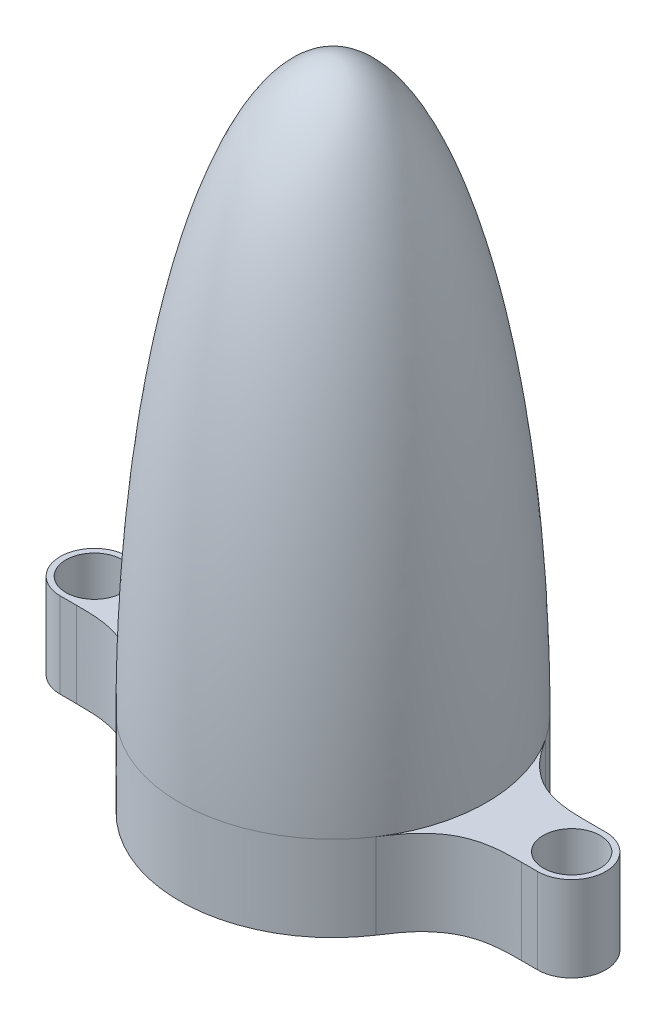
ISO-10303-21;
HEADER;
FILE_DESCRIPTION(('STEP AP214'),'2;1');
FILE_NAME('part.step','',(''),(''),'','','');
FILE_SCHEMA(('AUTOMOTIVE_DESIGN { 1 0 10303 214 1 1 1 1 }'));
ENDSEC;
DATA;
#1=APPLICATION_CONTEXT('core data for automotive mechanical design processes');
#2=APPLICATION_PROTOCOL_DEFINITION('international standard','automotive_design',2000,#1);
#3=PRODUCT_CONTEXT('',#1,'mechanical');
#4=PRODUCT('Part','Part','',(#3));
#5=PRODUCT_RELATED_PRODUCT_CATEGORY('part','',(#4));
#6=PRODUCT_DEFINITION_FORMATION('','',#4);
#7=PRODUCT_DEFINITION_CONTEXT('part definition',#1,'design');
#8=PRODUCT_DEFINITION('design','',#6,#7);
#9=PRODUCT_DEFINITION_SHAPE('','',#8);
#10=(LENGTH_UNIT() NAMED_UNIT(*) SI_UNIT(.MILLI.,.METRE.));
#11=(NAMED_UNIT(*) PLANE_ANGLE_UNIT() SI_UNIT($,.RADIAN.));
#12=(NAMED_UNIT(*) SI_UNIT($,.STERADIAN.) SOLID_ANGLE_UNIT());
#13=UNCERTAINTY_MEASURE_WITH_UNIT(LENGTH_MEASURE(1.E-05),#10,'distance_accuracy_value','');
#14=(GEOMETRIC_REPRESENTATION_CONTEXT(3) GLOBAL_UNCERTAINTY_ASSIGNED_CONTEXT((#13)) GLOBAL_UNIT_ASSIGNED_CONTEXT((#10,
#11,#12)) REPRESENTATION_CONTEXT('',''));
#15=CARTESIAN_POINT('',(0.,0.,0.));
#16=DIRECTION('',(0.,0.,1.));
#17=DIRECTION('',(1.,0.,0.));
#18=AXIS2_PLACEMENT_3D('',#15,#16,#17);
#19=CARTESIAN_POINT('',(0.,15.,0.));
#20=DIRECTION('',(0.,1.,0.));
#21=DIRECTION('',(0.,0.,1.));
#22=AXIS2_PLACEMENT_3D('',#19,#20,#21);
#23=PLANE('',#22);
#24=CARTESIAN_POINT('',(-42.,15.,0.));
#25=DIRECTION('',(0.,1.,0.));
#26=DIRECTION('',(0.,0.,1.));
#27=AXIS2_PLACEMENT_3D('',#24,#25,#26);
#28=CIRCLE('',#27,5.);
#29=CARTESIAN_POINT('',(-42.,15.,5.));
#30=VERTEX_POINT('',#29);
#31=EDGE_CURVE('E417',#30,#30,#28,.T.);
#32=ORIENTED_EDGE('',*,*,#31,.F.);
#33=EDGE_LOOP('',(#32));
#34=FACE_BOUND('',#33,.T.);
#35=CARTESIAN_POINT('',(-22.4924613898807,15.,14.9361702127662));
#36=CARTESIAN_POINT('',(-23.3032251088838,15.,13.71523664102));
#37=CARTESIAN_POINT('',(-24.1883136926682,15.,12.2026104979751));
#38=CARTESIAN_POINT('',(-27.3449063447516,15.,8.24468675659149));
#39=CARTESIAN_POINT('',(-31.1830848978388,15.,6.43790844660435));
#40=CARTESIAN_POINT('',(-35.2832759163573,15.,5.99999999999523));
#41=CARTESIAN_POINT('',(-37.2184099086305,15.,5.99999999999762));
#42=CARTESIAN_POINT('',(-39.1535439009038,15.,6.));
#43=B_SPLINE_CURVE_WITH_KNOTS('',5,(#35,#36,#37,#38,#39,#40,#41,#42),.UNSPECIFIED.,.F.,.F.,(6,2,
6),(0.,0.5,1.),.UNSPECIFIED.);
#44=CARTESIAN_POINT('',(-22.4924613898807,15.,14.9361702127662));
#45=VERTEX_POINT('',#44);
#46=CARTESIAN_POINT('',(-39.1535439009038,15.,6.));
#47=VERTEX_POINT('',#46);
#48=EDGE_CURVE('E62',#45,#47,#43,.T.);
#49=ORIENTED_EDGE('',*,*,#48,.F.);
#50=CARTESIAN_POINT('',(0.,15.,0.));
#51=DIRECTION('',(0.,-1.,0.));
#52=DIRECTION('',(0.,0.,-1.));
#53=AXIS2_PLACEMENT_3D('',#50,#51,#52);
#54=CIRCLE('',#53,27.);
#55=CARTESIAN_POINT('',(-22.4924613898804,15.,-14.9361702127668));
#56=VERTEX_POINT('',#55);
#57=EDGE_CURVE('E397',#45,#56,#54,.T.);
#58=ORIENTED_EDGE('',*,*,#57,.T.);
#59=CARTESIAN_POINT('',(-39.1535439009038,15.,-6.00000000000001));
#60=CARTESIAN_POINT('',(-37.2184099086401,15.,-5.99999999999285));
#61=CARTESIAN_POINT('',(-35.2832759163763,15.,-5.99999999998748));
#62=CARTESIAN_POINT('',(-31.1830848978484,15.,-6.4379084465972));
#63=CARTESIAN_POINT('',(-27.3449063447301,15.,-8.24468675658434));
#64=CARTESIAN_POINT('',(-24.1883136926539,15.,-12.2026104979882));
#65=CARTESIAN_POINT('',(-23.3032251088743,15.,-13.7152366410295));
#66=CARTESIAN_POINT('',(-22.4924613898804,15.,-14.9361702127668));
#67=B_SPLINE_CURVE_WITH_KNOTS('',5,(#59,#60,#61,#62,#63,#64,#65,#66),.UNSPECIFIED.,.F.,.F.,(6,2,
6),(0.,0.5,1.),.UNSPECIFIED.);
#68=CARTESIAN_POINT('',(-39.1535439009038,15.,-6.));
#69=VERTEX_POINT('',#68);
#70=EDGE_CURVE('E394',#69,#56,#67,.T.);
#71=ORIENTED_EDGE('',*,*,#70,.F.);
#72=DIRECTION('',(1.,0.,0.));
#73=VECTOR('',#72,1.);
#74=CARTESIAN_POINT('',(0.,15.,-6.));
#75=LINE('',#74,#73);
#76=CARTESIAN_POINT('',(-42.,15.,-6.));
#77=VERTEX_POINT('',#76);
#78=EDGE_CURVE('E212',#77,#69,#75,.T.);
#79=ORIENTED_EDGE('',*,*,#78,.F.);
#80=CARTESIAN_POINT('',(-42.,15.,0.));
#81=DIRECTION('',(0.,1.,0.));
#82=DIRECTION('',(0.,0.,1.));
#83=AXIS2_PLACEMENT_3D('',#80,#81,#82);
#84=CIRCLE('',#83,5.99999999999999);
#85=CARTESIAN_POINT('',(-42.,15.,6.));
#86=VERTEX_POINT('',#85);
#87=EDGE_CURVE('E349',#77,#86,#84,.T.);
#88=ORIENTED_EDGE('',*,*,#87,.T.);
#89=DIRECTION('',(1.,0.,0.));
#90=VECTOR('',#89,1.);
#91=CARTESIAN_POINT('',(0.,15.,6.));
#92=LINE('',#91,#90);
#93=EDGE_CURVE('E336',#86,#47,#92,.T.);
#94=ORIENTED_EDGE('',*,*,#93,.T.);
#95=EDGE_LOOP('',(#49,#58,#71,#79,#88,#94));
#96=FACE_BOUND('',#95,.T.);
#97=ADVANCED_FACE('F46',(#34,#96),#23,.T.);
#98=CARTESIAN_POINT('',(42.,15.,0.));
#99=DIRECTION('',(0.,1.,0.));
#100=DIRECTION('',(0.,0.,1.));
#101=AXIS2_PLACEMENT_3D('',#98,#99,#100);
#102=CIRCLE('',#101,5.);
#103=CARTESIAN_POINT('',(42.,15.,5.));
#104=VERTEX_POINT('',#103);
#105=EDGE_CURVE('E281',#104,#104,#102,.T.);
#106=ORIENTED_EDGE('',*,*,#105,.F.);
#107=EDGE_LOOP('',(#106));
#108=FACE_BOUND('',#107,.T.);
#109=CARTESIAN_POINT('',(22.4924613898807,15.,-14.9361702127662));
#110=CARTESIAN_POINT('',(23.3032251088838,15.,-13.71523664102));
#111=CARTESIAN_POINT('',(24.1883136926682,15.,-12.2026104979751));
#112=CARTESIAN_POINT('',(27.3449063447516,15.,-8.24468675659149));
#113=CARTESIAN_POINT('',(31.1830848978388,15.,-6.43790844660435));
#114=CARTESIAN_POINT('',(35.2832759163573,15.,-5.99999999999523));
#115=CARTESIAN_POINT('',(37.2184099086305,15.,-5.99999999999762));
#116=CARTESIAN_POINT('',(39.1535439009038,15.,-6.));
#117=B_SPLINE_CURVE_WITH_KNOTS('',5,(#109,#110,#111,#112,#113,#114,#115,#116),.UNSPECIFIED.,.F.,
.F.,(6,2,6),(0.,0.5,1.),.UNSPECIFIED.);
#118=CARTESIAN_POINT('',(22.4924613898807,15.,-14.9361702127662));
#119=VERTEX_POINT('',#118);
#120=CARTESIAN_POINT('',(39.1535439009038,15.,-6.));
#121=VERTEX_POINT('',#120);
#122=EDGE_CURVE('E322',#119,#121,#117,.T.);
#123=ORIENTED_EDGE('',*,*,#122,.F.);
#124=CARTESIAN_POINT('',(22.4924642755178,15.,14.9361658672684));
#125=VERTEX_POINT('',#124);
#126=EDGE_CURVE('E398',#119,#125,#54,.T.);
#127=ORIENTED_EDGE('',*,*,#126,.T.);
#128=CARTESIAN_POINT('',(39.1535439009038,15.,6.00000000000001));
#129=CARTESIAN_POINT('',(37.2184099086401,15.,5.99999999999285));
#130=CARTESIAN_POINT('',(35.2832759163763,15.,5.99999999998748));
#131=CARTESIAN_POINT('',(31.1830848978484,15.,6.4379084465972));
#132=CARTESIAN_POINT('',(27.3449063447301,15.,8.24468675658434));
#133=CARTESIAN_POINT('',(24.1883136926539,15.,12.2026104979882));
#134=CARTESIAN_POINT('',(23.3032251088743,15.,13.7152366410295));
#135=CARTESIAN_POINT('',(22.4924613898804,15.,14.9361702127668));
#136=B_SPLINE_CURVE_WITH_KNOTS('',5,(#128,#129,#130,#131,#132,#133,#134,#135),.UNSPECIFIED.,.F.,
.F.,(6,2,6),(0.,0.5,1.),.UNSPECIFIED.);
#137=CARTESIAN_POINT('',(39.1535439009038,15.,6.));
#138=VERTEX_POINT('',#137);
#139=EDGE_CURVE('E435',#138,#125,#136,.T.);
#140=ORIENTED_EDGE('',*,*,#139,.F.);
#141=DIRECTION('',(-1.,0.,0.));
#142=VECTOR('',#141,1.);
#143=CARTESIAN_POINT('',(0.,15.,6.));
#144=LINE('',#143,#142);
#145=CARTESIAN_POINT('',(42.,15.,6.));
#146=VERTEX_POINT('',#145);
#147=EDGE_CURVE('E270',#146,#138,#144,.T.);
#148=ORIENTED_EDGE('',*,*,#147,.F.);
#149=CARTESIAN_POINT('',(42.,15.,0.));
#150=DIRECTION('',(0.,1.,0.));
#151=DIRECTION('',(0.,0.,1.));
#152=AXIS2_PLACEMENT_3D('',#149,#150,#151);
#153=CIRCLE('',#152,5.99999999999999);
#154=CARTESIAN_POINT('',(42.,15.,-6.));
#155=VERTEX_POINT('',#154);
#156=EDGE_CURVE('E280',#155,#146,#153,.F.);
#157=ORIENTED_EDGE('',*,*,#156,.F.);
#158=DIRECTION('',(-1.,0.,0.));
#159=VECTOR('',#158,1.);
#160=CARTESIAN_POINT('',(0.,15.,-6.));
#161=LINE('',#160,#159);
#162=EDGE_CURVE('E292',#155,#121,#161,.T.);
#163=ORIENTED_EDGE('',*,*,#162,.T.);
#164=EDGE_LOOP('',(#123,#127,#140,#148,#157,#163));
#165=FACE_BOUND('',#164,.T.);
#166=ADVANCED_FACE('F158',(#108,#165),#23,.T.);
#167=CARTESIAN_POINT('',(-22.4924613898809,16.5,14.936170212766));
#168=CARTESIAN_POINT('',(-22.4924613898801,10.4999999999935,14.9361702127671));
#169=CARTESIAN_POINT('',(-22.4924613898801,4.5,14.9361702127671));
#170=CARTESIAN_POINT('',(-22.4924613898809,-1.5,14.936170212766));
#171=CARTESIAN_POINT('',(-23.3032251088886,16.5,13.7152366410188));
#172=CARTESIAN_POINT('',(-23.3032251088677,10.4999999999935,13.715236641024));
#173=CARTESIAN_POINT('',(-23.3032251088677,4.5,13.715236641024));
#174=CARTESIAN_POINT('',(-23.3032251088886,-1.5,13.7152366410188));
#175=CARTESIAN_POINT('',(-24.1883136926754,16.5,12.2026104979739));
#176=CARTESIAN_POINT('',(-24.1883136926442,10.4999999999935,12.2026104979791));
#177=CARTESIAN_POINT('',(-24.1883136926442,4.5,12.2026104979791));
#178=CARTESIAN_POINT('',(-24.1883136926754,-1.5,12.2026104979739));
#179=CARTESIAN_POINT('',(-27.3449063447587,16.5,8.24468675659149));
#180=CARTESIAN_POINT('',(-27.3449063447275,10.4999999999935,8.24468675659149));
#181=CARTESIAN_POINT('',(-27.3449063447275,4.5,8.24468675659149));
#182=CARTESIAN_POINT('',(-27.3449063447587,-1.5,8.24468675659149));
#183=CARTESIAN_POINT('',(-31.1830848978341,16.5,6.43790844660972));
#184=CARTESIAN_POINT('',(-31.1830848978549,10.4999999999935,6.4379084465863));
#185=CARTESIAN_POINT('',(-31.1830848978549,4.5,6.4379084465863));
#186=CARTESIAN_POINT('',(-31.1830848978341,-1.5,6.43790844660972));
#187=CARTESIAN_POINT('',(-35.2832759163477,16.5,6.));
#188=CARTESIAN_POINT('',(-35.2832759163894,10.4999999999935,5.99999999997918));
#189=CARTESIAN_POINT('',(-35.2832759163893,4.5,5.99999999997918));
#190=CARTESIAN_POINT('',(-35.2832759163477,-1.5,6.));
#191=CARTESIAN_POINT('',(-37.2184099086258,16.5,6.));
#192=CARTESIAN_POINT('',(-37.2184099086466,10.4999999999935,5.99999999998959));
#193=CARTESIAN_POINT('',(-37.2184099086466,4.5,5.99999999998959));
#194=CARTESIAN_POINT('',(-37.2184099086258,-1.5,6.));
#195=CARTESIAN_POINT('',(-39.1535439009038,16.5,6.));
#196=CARTESIAN_POINT('',(-39.1535439009038,10.4999999999935,6.));
#197=CARTESIAN_POINT('',(-39.1535439009038,4.5,6.));
#198=CARTESIAN_POINT('',(-39.1535439009038,-1.5,6.));
#199=B_SPLINE_SURFACE_WITH_KNOTS('',5,3,((#167,#168,#169,#170),(#171,#172,#173,#174),(#175,#176,
#177,#178),(#179,#180,#181,#182),(#183,#184,#185,#186),(#187,#188,#189,#190),(#191,#192,#193,
#194),(#195,#196,#197,#198)),.UNSPECIFIED.,.F.,.F.,.F.,(6,2,6),(4,4),(0.,0.5,1.),(-0.0015,
0.0165),.UNSPECIFIED.);
#200=CARTESIAN_POINT('',(-22.4924613898809,-1.5,14.936170212766));
#201=CARTESIAN_POINT('',(-22.4924613898801,4.5,14.9361702127671));
#202=CARTESIAN_POINT('',(-22.4924613898801,10.4999999999935,14.9361702127671));
#203=CARTESIAN_POINT('',(-22.4924613898809,16.5,14.936170212766));
#204=B_SPLINE_CURVE_WITH_KNOTS('',3,(#200,#201,#202,#203),.UNSPECIFIED.,.F.,.F.,(4,4),(-0.0015,
0.0165),.UNSPECIFIED.);
#205=CARTESIAN_POINT('',(-22.4924613898807,0.,14.9361702127662));
#206=VERTEX_POINT('',#205);
#207=EDGE_CURVE('E681',#45,#206,#204,.F.);
#208=CARTESIAN_POINT('',(-39.1535439009038,16.5,6.));
#209=CARTESIAN_POINT('',(-39.1535439009038,10.4999999999935,6.));
#210=CARTESIAN_POINT('',(-39.1535439009038,4.5,6.));
#211=CARTESIAN_POINT('',(-39.1535439009038,-1.5,6.));
#212=B_SPLINE_CURVE_WITH_KNOTS('',3,(#208,#209,#210,#211),.UNSPECIFIED.,.F.,.F.,(4,4),(-0.0015,
0.0165),.UNSPECIFIED.);
#213=CARTESIAN_POINT('',(-39.1535439009038,0.,6.));
#214=VERTEX_POINT('',#213);
#215=EDGE_CURVE('E354',#214,#47,#212,.F.);
#216=CARTESIAN_POINT('',(-39.1535439009038,0.,6.));
#217=CARTESIAN_POINT('',(-37.2184099086305,0.,5.99999999999762));
#218=CARTESIAN_POINT('',(-35.2832759163573,0.,5.99999999999523));
#219=CARTESIAN_POINT('',(-31.1830848978388,0.,6.43790844660435));
#220=CARTESIAN_POINT('',(-27.3449063447516,0.,8.24468675659149));
#221=CARTESIAN_POINT('',(-24.1883136926682,0.,12.2026104979751));
#222=CARTESIAN_POINT('',(-23.3032251088838,0.,13.71523664102));
#223=CARTESIAN_POINT('',(-22.4924613898807,0.,14.9361702127662));
#224=B_SPLINE_CURVE_WITH_KNOTS('',5,(#216,#217,#218,#219,#220,#221,#222,#223),.UNSPECIFIED.,.F.,
.F.,(6,2,6),(0.,0.5,1.),.UNSPECIFIED.);
#225=EDGE_CURVE('E12',#214,#206,#224,.T.);
#226=ORIENTED_EDGE('',*,*,#207,.F.);
#227=ORIENTED_EDGE('',*,*,#48,.T.);
#228=ORIENTED_EDGE('',*,*,#215,.F.);
#229=ORIENTED_EDGE('',*,*,#225,.T.);
#230=EDGE_LOOP('',(#226,#227,#228,#229));
#231=FACE_BOUND('',#230,.T.);
#232=ADVANCED_FACE('F49',(#231),#199,.T.);
#233=CARTESIAN_POINT('',(39.1535439009038,16.5,6.00000000000001));
#234=CARTESIAN_POINT('',(39.1535439009038,10.4999999999935,6.00000000000001));
#235=CARTESIAN_POINT('',(39.1535439009038,4.5,6.00000000000001));
#236=CARTESIAN_POINT('',(39.1535439009038,-1.5,6.00000000000001));
#237=CARTESIAN_POINT('',(37.2184099086257,16.5,6.00000000000001));
#238=CARTESIAN_POINT('',(37.2184099086882,10.4999999999935,5.99999999996878));
#239=CARTESIAN_POINT('',(37.2184099086882,4.5,5.99999999996878));
#240=CARTESIAN_POINT('',(37.2184099086257,-1.5,6.00000000000001));
#241=CARTESIAN_POINT('',(35.2832759163477,16.5,6.00000000000001));
#242=CARTESIAN_POINT('',(35.2832759164726,10.4999999999935,5.99999999994536));
#243=CARTESIAN_POINT('',(35.2832759164726,4.5,5.99999999994536));
#244=CARTESIAN_POINT('',(35.2832759163477,-1.5,6.00000000000001));
#245=CARTESIAN_POINT('',(31.1830848978341,16.5,6.43790844660972));
#246=CARTESIAN_POINT('',(31.1830848978965,10.4999999999935,6.43790844655508));
#247=CARTESIAN_POINT('',(31.1830848978965,4.5,6.43790844655508));
#248=CARTESIAN_POINT('',(31.1830848978341,-1.5,6.43790844660972));
#249=CARTESIAN_POINT('',(27.3449063447588,16.5,8.24468675659149));
#250=CARTESIAN_POINT('',(27.3449063446339,10.4999999999935,8.24468675656027));
#251=CARTESIAN_POINT('',(27.3449063446339,4.5,8.24468675656027));
#252=CARTESIAN_POINT('',(27.3449063447588,-1.5,8.24468675659149));
#253=CARTESIAN_POINT('',(24.1883136926754,16.5,12.2026104979739));
#254=CARTESIAN_POINT('',(24.1883136925817,10.4999999999935,12.2026104980364));
#255=CARTESIAN_POINT('',(24.1883136925817,4.5,12.2026104980364));
#256=CARTESIAN_POINT('',(24.1883136926754,-1.5,12.2026104979739));
#257=CARTESIAN_POINT('',(23.3032251088886,16.5,13.7152366410188));
#258=CARTESIAN_POINT('',(23.3032251088261,10.4999999999935,13.7152366410656));
#259=CARTESIAN_POINT('',(23.3032251088261,4.5,13.7152366410656));
#260=CARTESIAN_POINT('',(23.3032251088886,-1.5,13.7152366410188));
#261=CARTESIAN_POINT('',(22.4924613898809,16.5,14.936170212766));
#262=CARTESIAN_POINT('',(22.4924613898785,10.4999999999935,14.9361702127695));
#263=CARTESIAN_POINT('',(22.4924613898785,4.5,14.9361702127695));
#264=CARTESIAN_POINT('',(22.4924613898809,-1.5,14.936170212766));
#265=B_SPLINE_SURFACE_WITH_KNOTS('',5,3,((#233,#234,#235,#236),(#237,#238,#239,#240),(#241,#242,
#243,#244),(#245,#246,#247,#248),(#249,#250,#251,#252),(#253,#254,#255,#256),(#257,#258,#259,
#260),(#261,#262,#263,#264)),.UNSPECIFIED.,.F.,.F.,.F.,(6,2,6),(4,4),(0.,0.5,1.),(-0.0015,
0.0165),.UNSPECIFIED.);
#266=CARTESIAN_POINT('',(22.4924613898809,16.5,14.936170212766));
#267=CARTESIAN_POINT('',(22.4924613898785,10.4999999999935,14.9361702127695));
#268=CARTESIAN_POINT('',(22.4924613898785,4.5,14.9361702127695));
#269=CARTESIAN_POINT('',(22.4924613898809,-1.5,14.936170212766));
#270=B_SPLINE_CURVE_WITH_KNOTS('',3,(#266,#267,#268,#269),.UNSPECIFIED.,.F.,.F.,(4,4),(-0.0015,
0.0165),.UNSPECIFIED.);
#271=CARTESIAN_POINT('',(22.4924613898804,0.,14.9361702127668));
#272=VERTEX_POINT('',#271);
#273=EDGE_CURVE('E440',#272,#125,#270,.F.);
#274=CARTESIAN_POINT('',(22.4924613898804,0.,14.9361702127668));
#275=CARTESIAN_POINT('',(23.3032251088743,0.,13.7152366410295));
#276=CARTESIAN_POINT('',(24.1883136926539,0.,12.2026104979882));
#277=CARTESIAN_POINT('',(27.3449063447301,0.,8.24468675658434));
#278=CARTESIAN_POINT('',(31.1830848978484,0.,6.4379084465972));
#279=CARTESIAN_POINT('',(35.2832759163763,0.,5.99999999998748));
#280=CARTESIAN_POINT('',(37.2184099086401,0.,5.99999999999285));
#281=CARTESIAN_POINT('',(39.1535439009038,0.,6.00000000000001));
#282=B_SPLINE_CURVE_WITH_KNOTS('',5,(#274,#275,#276,#277,#278,#279,#280,#281),.UNSPECIFIED.,.F.,
.F.,(6,2,6),(0.,0.5,1.),.UNSPECIFIED.);
#283=CARTESIAN_POINT('',(39.1535439009038,0.,6.));
#284=VERTEX_POINT('',#283);
#285=EDGE_CURVE('E428',#272,#284,#282,.T.);
#286=CARTESIAN_POINT('',(39.1535439009038,-1.5,6.00000000000001));
#287=CARTESIAN_POINT('',(39.1535439009038,4.5,6.00000000000001));
#288=CARTESIAN_POINT('',(39.1535439009038,10.4999999999935,6.00000000000001));
#289=CARTESIAN_POINT('',(39.1535439009038,16.5,6.00000000000001));
#290=B_SPLINE_CURVE_WITH_KNOTS('',3,(#286,#287,#288,#289),.UNSPECIFIED.,.F.,.F.,(4,4),(-0.0015,
0.0165),.UNSPECIFIED.);
#291=EDGE_CURVE('E436',#138,#284,#290,.F.);
#292=ORIENTED_EDGE('',*,*,#273,.F.);
#293=ORIENTED_EDGE('',*,*,#285,.T.);
#294=ORIENTED_EDGE('',*,*,#291,.F.);
#295=ORIENTED_EDGE('',*,*,#139,.T.);
#296=EDGE_LOOP('',(#292,#293,#294,#295));
#297=FACE_BOUND('',#296,.T.);
#298=ADVANCED_FACE('F442',(#297),#265,.T.);
#299=CARTESIAN_POINT('',(22.4924613898809,16.5,-14.936170212766));
#300=CARTESIAN_POINT('',(22.4924613898801,10.4999999999935,-14.9361702127671));
#301=CARTESIAN_POINT('',(22.4924613898801,4.5,-14.9361702127671));
#302=CARTESIAN_POINT('',(22.4924613898809,-1.5,-14.936170212766));
#303=CARTESIAN_POINT('',(23.3032251088886,16.5,-13.7152366410188));
#304=CARTESIAN_POINT('',(23.3032251088677,10.4999999999935,-13.715236641024));
#305=CARTESIAN_POINT('',(23.3032251088677,4.5,-13.715236641024));
#306=CARTESIAN_POINT('',(23.3032251088886,-1.5,-13.7152366410188));
#307=CARTESIAN_POINT('',(24.1883136926754,16.5,-12.2026104979739));
#308=CARTESIAN_POINT('',(24.1883136926442,10.4999999999935,-12.2026104979791));
#309=CARTESIAN_POINT('',(24.1883136926442,4.5,-12.2026104979791));
#310=CARTESIAN_POINT('',(24.1883136926754,-1.5,-12.2026104979739));
#311=CARTESIAN_POINT('',(27.3449063447587,16.5,-8.24468675659149));
#312=CARTESIAN_POINT('',(27.3449063447275,10.4999999999935,-8.24468675659149));
#313=CARTESIAN_POINT('',(27.3449063447275,4.5,-8.24468675659149));
#314=CARTESIAN_POINT('',(27.3449063447587,-1.5,-8.24468675659149));
#315=CARTESIAN_POINT('',(31.1830848978341,16.5,-6.43790844660972));
#316=CARTESIAN_POINT('',(31.1830848978549,10.4999999999935,-6.4379084465863));
#317=CARTESIAN_POINT('',(31.1830848978549,4.5,-6.4379084465863));
#318=CARTESIAN_POINT('',(31.1830848978341,-1.5,-6.43790844660972));
#319=CARTESIAN_POINT('',(35.2832759163477,16.5,-6.));
#320=CARTESIAN_POINT('',(35.2832759163894,10.4999999999935,-5.99999999997918));
#321=CARTESIAN_POINT('',(35.2832759163893,4.5,-5.99999999997918));
#322=CARTESIAN_POINT('',(35.2832759163477,-1.5,-6.));
#323=CARTESIAN_POINT('',(37.2184099086258,16.5,-6.));
#324=CARTESIAN_POINT('',(37.2184099086466,10.4999999999935,-5.99999999998959));
#325=CARTESIAN_POINT('',(37.2184099086466,4.5,-5.99999999998959));
#326=CARTESIAN_POINT('',(37.2184099086258,-1.5,-6.));
#327=CARTESIAN_POINT('',(39.1535439009038,16.5,-6.));
#328=CARTESIAN_POINT('',(39.1535439009038,10.4999999999935,-6.));
#329=CARTESIAN_POINT('',(39.1535439009038,4.5,-6.));
#330=CARTESIAN_POINT('',(39.1535439009038,-1.5,-6.));
#331=B_SPLINE_SURFACE_WITH_KNOTS('',5,3,((#299,#300,#301,#302),(#303,#304,#305,#306),(#307,#308,
#309,#310),(#311,#312,#313,#314),(#315,#316,#317,#318),(#319,#320,#321,#322),(#323,#324,#325,
#326),(#327,#328,#329,#330)),.UNSPECIFIED.,.F.,.F.,.F.,(6,2,6),(4,4),(0.,0.5,1.),(-0.0015,
0.0165),.UNSPECIFIED.);
#332=CARTESIAN_POINT('',(39.1535439009038,16.5,-6.));
#333=CARTESIAN_POINT('',(39.1535439009038,10.4999999999935,-6.));
#334=CARTESIAN_POINT('',(39.1535439009038,4.5,-6.));
#335=CARTESIAN_POINT('',(39.1535439009038,-1.5,-6.));
#336=B_SPLINE_CURVE_WITH_KNOTS('',3,(#332,#333,#334,#335),.UNSPECIFIED.,.F.,.F.,(4,4),(-0.0015,
0.0165),.UNSPECIFIED.);
#337=CARTESIAN_POINT('',(39.1535439009038,0.,-6.));
#338=VERTEX_POINT('',#337);
#339=EDGE_CURVE('E313',#338,#121,#336,.F.);
#340=CARTESIAN_POINT('',(39.1535439009038,0.,-6.));
#341=CARTESIAN_POINT('',(37.2184099086305,0.,-5.99999999999762));
#342=CARTESIAN_POINT('',(35.2832759163573,0.,-5.99999999999523));
#343=CARTESIAN_POINT('',(31.1830848978388,0.,-6.43790844660435));
#344=CARTESIAN_POINT('',(27.3449063447516,0.,-8.24468675659149));
#345=CARTESIAN_POINT('',(24.1883136926682,0.,-12.2026104979751));
#346=CARTESIAN_POINT('',(23.3032251088838,0.,-13.71523664102));
#347=CARTESIAN_POINT('',(22.4924613898807,0.,-14.9361702127662));
#348=B_SPLINE_CURVE_WITH_KNOTS('',5,(#340,#341,#342,#343,#344,#345,#346,#347),.UNSPECIFIED.,.F.,
.F.,(6,2,6),(0.,0.5,1.),.UNSPECIFIED.);
#349=CARTESIAN_POINT('',(22.4924613898807,0.,-14.9361702127662));
#350=VERTEX_POINT('',#349);
#351=EDGE_CURVE('E607',#338,#350,#348,.T.);
#352=CARTESIAN_POINT('',(22.4924613898809,-1.5,-14.936170212766));
#353=CARTESIAN_POINT('',(22.4924613898801,4.5,-14.9361702127671));
#354=CARTESIAN_POINT('',(22.4924613898801,10.4999999999935,-14.9361702127671));
#355=CARTESIAN_POINT('',(22.4924613898809,16.5,-14.936170212766));
#356=B_SPLINE_CURVE_WITH_KNOTS('',3,(#352,#353,#354,#355),.UNSPECIFIED.,.F.,.F.,(4,4),(-0.0015,
0.0165),.UNSPECIFIED.);
#357=EDGE_CURVE('E233',#119,#350,#356,.F.);
#358=ORIENTED_EDGE('',*,*,#339,.F.);
#359=ORIENTED_EDGE('',*,*,#351,.T.);
#360=ORIENTED_EDGE('',*,*,#357,.F.);
#361=ORIENTED_EDGE('',*,*,#122,.T.);
#362=EDGE_LOOP('',(#358,#359,#360,#361));
#363=FACE_BOUND('',#362,.T.);
#364=ADVANCED_FACE('F467',(#363),#331,.T.);
#365=CARTESIAN_POINT('',(-39.1535439009038,16.5,-6.00000000000001));
#366=CARTESIAN_POINT('',(-39.1535439009038,10.4999999999935,-6.00000000000001));
#367=CARTESIAN_POINT('',(-39.1535439009038,4.5,-6.00000000000001));
#368=CARTESIAN_POINT('',(-39.1535439009038,-1.5,-6.00000000000001));
#369=CARTESIAN_POINT('',(-37.2184099086257,16.5,-6.00000000000001));
#370=CARTESIAN_POINT('',(-37.2184099086882,10.4999999999935,-5.99999999996878));
#371=CARTESIAN_POINT('',(-37.2184099086882,4.5,-5.99999999996878));
#372=CARTESIAN_POINT('',(-37.2184099086257,-1.5,-6.00000000000001));
#373=CARTESIAN_POINT('',(-35.2832759163477,16.5,-6.00000000000001));
#374=CARTESIAN_POINT('',(-35.2832759164726,10.4999999999935,-5.99999999994536));
#375=CARTESIAN_POINT('',(-35.2832759164726,4.5,-5.99999999994536));
#376=CARTESIAN_POINT('',(-35.2832759163477,-1.5,-6.00000000000001));
#377=CARTESIAN_POINT('',(-31.1830848978341,16.5,-6.43790844660972));
#378=CARTESIAN_POINT('',(-31.1830848978965,10.4999999999935,-6.43790844655508));
#379=CARTESIAN_POINT('',(-31.1830848978965,4.5,-6.43790844655508));
#380=CARTESIAN_POINT('',(-31.1830848978341,-1.5,-6.43790844660972));
#381=CARTESIAN_POINT('',(-27.3449063447588,16.5,-8.24468675659149));
#382=CARTESIAN_POINT('',(-27.3449063446339,10.4999999999935,-8.24468675656027));
#383=CARTESIAN_POINT('',(-27.3449063446339,4.5,-8.24468675656027));
#384=CARTESIAN_POINT('',(-27.3449063447588,-1.5,-8.24468675659149));
#385=CARTESIAN_POINT('',(-24.1883136926754,16.5,-12.2026104979739));
#386=CARTESIAN_POINT('',(-24.1883136925817,10.4999999999935,-12.2026104980364));
#387=CARTESIAN_POINT('',(-24.1883136925817,4.5,-12.2026104980364));
#388=CARTESIAN_POINT('',(-24.1883136926754,-1.5,-12.2026104979739));
#389=CARTESIAN_POINT('',(-23.3032251088886,16.5,-13.7152366410188));
#390=CARTESIAN_POINT('',(-23.3032251088261,10.4999999999935,-13.7152366410656));
#391=CARTESIAN_POINT('',(-23.3032251088261,4.5,-13.7152366410656));
#392=CARTESIAN_POINT('',(-23.3032251088886,-1.5,-13.7152366410188));
#393=CARTESIAN_POINT('',(-22.4924613898809,16.5,-14.936170212766));
#394=CARTESIAN_POINT('',(-22.4924613898785,10.4999999999935,-14.9361702127695));
#395=CARTESIAN_POINT('',(-22.4924613898785,4.5,-14.9361702127695));
#396=CARTESIAN_POINT('',(-22.4924613898809,-1.5,-14.936170212766));
#397=B_SPLINE_SURFACE_WITH_KNOTS('',5,3,((#365,#366,#367,#368),(#369,#370,#371,#372),(#373,#374,
#375,#376),(#377,#378,#379,#380),(#381,#382,#383,#384),(#385,#386,#387,#388),(#389,#390,#391,
#392),(#393,#394,#395,#396)),.UNSPECIFIED.,.F.,.F.,.F.,(6,2,6),(4,4),(0.,0.5,1.),(-0.0015,
0.0165),.UNSPECIFIED.);
#398=CARTESIAN_POINT('',(-39.1535439009038,-1.5,-6.00000000000001));
#399=CARTESIAN_POINT('',(-39.1535439009038,4.5,-6.00000000000001));
#400=CARTESIAN_POINT('',(-39.1535439009038,10.4999999999935,-6.00000000000001));
#401=CARTESIAN_POINT('',(-39.1535439009038,16.5,-6.00000000000001));
#402=B_SPLINE_CURVE_WITH_KNOTS('',3,(#398,#399,#400,#401),.UNSPECIFIED.,.F.,.F.,(4,4),(-0.0015,
0.0165),.UNSPECIFIED.);
#403=CARTESIAN_POINT('',(-39.1535439009038,0.,-6.));
#404=VERTEX_POINT('',#403);
#405=EDGE_CURVE('E395',#69,#404,#402,.F.);
#406=CARTESIAN_POINT('',(-22.4924613898809,16.5,-14.936170212766));
#407=CARTESIAN_POINT('',(-22.4924613898785,10.4999999999935,-14.9361702127695));
#408=CARTESIAN_POINT('',(-22.4924613898785,4.5,-14.9361702127695));
#409=CARTESIAN_POINT('',(-22.4924613898809,-1.5,-14.936170212766));
#410=B_SPLINE_CURVE_WITH_KNOTS('',3,(#406,#407,#408,#409),.UNSPECIFIED.,.F.,.F.,(4,4),(-0.0015,
0.0165),.UNSPECIFIED.);
#411=CARTESIAN_POINT('',(-22.4924613898804,0.,-14.9361702127668));
#412=VERTEX_POINT('',#411);
#413=EDGE_CURVE('E388',#412,#56,#410,.F.);
#414=CARTESIAN_POINT('',(-22.4924613898804,0.,-14.9361702127668));
#415=CARTESIAN_POINT('',(-23.3032251088743,0.,-13.7152366410295));
#416=CARTESIAN_POINT('',(-24.1883136926539,0.,-12.2026104979882));
#417=CARTESIAN_POINT('',(-27.3449063447301,0.,-8.24468675658434));
#418=CARTESIAN_POINT('',(-31.1830848978484,0.,-6.4379084465972));
#419=CARTESIAN_POINT('',(-35.2832759163763,0.,-5.99999999998748));
#420=CARTESIAN_POINT('',(-37.2184099086401,0.,-5.99999999999285));
#421=CARTESIAN_POINT('',(-39.1535439009038,0.,-6.00000000000001));
#422=B_SPLINE_CURVE_WITH_KNOTS('',5,(#414,#415,#416,#417,#418,#419,#420,#421),.UNSPECIFIED.,.F.,
.F.,(6,2,6),(0.,0.5,1.),.UNSPECIFIED.);
#423=EDGE_CURVE('E318',#412,#404,#422,.T.);
#424=ORIENTED_EDGE('',*,*,#405,.F.);
#425=ORIENTED_EDGE('',*,*,#70,.T.);
#426=ORIENTED_EDGE('',*,*,#413,.F.);
#427=ORIENTED_EDGE('',*,*,#423,.T.);
#428=EDGE_LOOP('',(#424,#425,#426,#427));
#429=FACE_BOUND('',#428,.T.);
#430=ADVANCED_FACE('F251',(#429),#397,.T.);
#431=CARTESIAN_POINT('',(0.,15.,0.));
#432=DIRECTION('',(0.,-1.,0.));
#433=DIRECTION('',(0.,0.,-1.));
#434=AXIS2_PLACEMENT_3D('',#431,#432,#433);
#435=CYLINDRICAL_SURFACE('',#434,27.);
#436=CARTESIAN_POINT('',(0.,15.,0.));
#437=DIRECTION('',(0.,1.,0.));
#438=DIRECTION('',(0.,0.,1.));
#439=AXIS2_PLACEMENT_3D('',#436,#437,#438);
#440=CIRCLE('',#439,27.);
#441=EDGE_CURVE('E205',#45,#125,#440,.T.);
#442=ORIENTED_EDGE('',*,*,#441,.F.);
#443=ORIENTED_EDGE('',*,*,#207,.T.);
#444=CARTESIAN_POINT('',(0.,0.,0.));
#445=DIRECTION('',(0.,1.,0.));
#446=DIRECTION('',(0.,0.,1.));
#447=AXIS2_PLACEMENT_3D('',#444,#445,#446);
#448=CIRCLE('',#447,27.);
#449=EDGE_CURVE('E194',#206,#272,#448,.T.);
#450=ORIENTED_EDGE('',*,*,#449,.T.);
#451=ORIENTED_EDGE('',*,*,#273,.T.);
#452=EDGE_LOOP('',(#442,#443,#450,#451));
#453=FACE_BOUND('',#452,.T.);
#454=ADVANCED_FACE('F249',(#453),#435,.T.);
#455=EDGE_CURVE('E203',#119,#56,#440,.T.);
#456=ORIENTED_EDGE('',*,*,#455,.F.);
#457=ORIENTED_EDGE('',*,*,#357,.T.);
#458=EDGE_CURVE('E204',#350,#412,#448,.T.);
#459=ORIENTED_EDGE('',*,*,#458,.T.);
#460=ORIENTED_EDGE('',*,*,#413,.T.);
#461=EDGE_LOOP('',(#456,#457,#459,#460));
#462=FACE_BOUND('',#461,.T.);
#463=ADVANCED_FACE('F240',(#462),#435,.T.);
#464=CARTESIAN_POINT('',(0.,0.,0.));
#465=DIRECTION('',(0.,1.,0.));
#466=DIRECTION('',(0.,0.,1.));
#467=AXIS2_PLACEMENT_3D('',#464,#465,#466);
#468=PLANE('',#467);
#469=CARTESIAN_POINT('',(42.,0.,0.));
#470=DIRECTION('',(0.,-1.,0.));
#471=DIRECTION('',(0.,0.,-1.));
#472=AXIS2_PLACEMENT_3D('',#469,#470,#471);
#473=CIRCLE('',#472,5.);
#474=CARTESIAN_POINT('',(42.,0.,-5.));
#475=VERTEX_POINT('',#474);
#476=EDGE_CURVE('E406',#475,#475,#473,.T.);
#477=ORIENTED_EDGE('',*,*,#476,.F.);
#478=EDGE_LOOP('',(#477));
#479=FACE_BOUND('',#478,.T.);
#480=CARTESIAN_POINT('',(-42.,0.,0.));
#481=DIRECTION('',(0.,-1.,0.));
#482=DIRECTION('',(0.,0.,-1.));
#483=AXIS2_PLACEMENT_3D('',#480,#481,#482);
#484=CIRCLE('',#483,5.);
#485=CARTESIAN_POINT('',(-42.,0.,-5.));
#486=VERTEX_POINT('',#485);
#487=EDGE_CURVE('E401',#486,#486,#484,.T.);
#488=ORIENTED_EDGE('',*,*,#487,.F.);
#489=EDGE_LOOP('',(#488));
#490=FACE_BOUND('',#489,.T.);
#491=CARTESIAN_POINT('',(0.,0.,0.));
#492=DIRECTION('',(0.,1.,0.));
#493=DIRECTION('',(0.,0.,1.));
#494=AXIS2_PLACEMENT_3D('',#491,#492,#493);
#495=CIRCLE('',#494,25.5);
#496=CARTESIAN_POINT('',(0.,0.,25.5));
#497=VERTEX_POINT('',#496);
#498=EDGE_CURVE('E220',#497,#497,#495,.T.);
#499=ORIENTED_EDGE('',*,*,#498,.T.);
#500=EDGE_LOOP('',(#499));
#501=FACE_BOUND('',#500,.T.);
#502=ORIENTED_EDGE('',*,*,#449,.F.);
#503=ORIENTED_EDGE('',*,*,#225,.F.);
#504=DIRECTION('',(1.,0.,0.));
#505=VECTOR('',#504,1.);
#506=CARTESIAN_POINT('',(0.,0.,6.));
#507=LINE('',#506,#505);
#508=CARTESIAN_POINT('',(-42.,0.,6.));
#509=VERTEX_POINT('',#508);
#510=EDGE_CURVE('E343',#509,#214,#507,.T.);
#511=ORIENTED_EDGE('',*,*,#510,.F.);
#512=CARTESIAN_POINT('',(-42.,0.,0.));
#513=DIRECTION('',(0.,1.,0.));
#514=DIRECTION('',(0.,0.,1.));
#515=AXIS2_PLACEMENT_3D('',#512,#513,#514);
#516=CIRCLE('',#515,5.99999999999999);
#517=CARTESIAN_POINT('',(-42.,0.,-6.));
#518=VERTEX_POINT('',#517);
#519=EDGE_CURVE('E623',#518,#509,#516,.T.);
#520=ORIENTED_EDGE('',*,*,#519,.F.);
#521=DIRECTION('',(1.,0.,0.));
#522=VECTOR('',#521,1.);
#523=CARTESIAN_POINT('',(0.,0.,-6.));
#524=LINE('',#523,#522);
#525=EDGE_CURVE('E348',#518,#404,#524,.T.);
#526=ORIENTED_EDGE('',*,*,#525,.T.);
#527=ORIENTED_EDGE('',*,*,#423,.F.);
#528=ORIENTED_EDGE('',*,*,#458,.F.);
#529=ORIENTED_EDGE('',*,*,#351,.F.);
#530=DIRECTION('',(-1.,0.,0.));
#531=VECTOR('',#530,1.);
#532=CARTESIAN_POINT('',(0.,0.,-6.));
#533=LINE('',#532,#531);
#534=CARTESIAN_POINT('',(42.,0.,-6.));
#535=VERTEX_POINT('',#534);
#536=EDGE_CURVE('E305',#535,#338,#533,.T.);
#537=ORIENTED_EDGE('',*,*,#536,.F.);
#538=CARTESIAN_POINT('',(42.,0.,0.));
#539=DIRECTION('',(0.,1.,0.));
#540=DIRECTION('',(0.,0.,1.));
#541=AXIS2_PLACEMENT_3D('',#538,#539,#540);
#542=CIRCLE('',#541,5.99999999999999);
#543=CARTESIAN_POINT('',(42.,0.,6.));
#544=VERTEX_POINT('',#543);
#545=EDGE_CURVE('E309',#535,#544,#542,.F.);
#546=ORIENTED_EDGE('',*,*,#545,.T.);
#547=DIRECTION('',(-1.,0.,0.));
#548=VECTOR('',#547,1.);
#549=CARTESIAN_POINT('',(0.,0.,6.));
#550=LINE('',#549,#548);
#551=EDGE_CURVE('E282',#544,#284,#550,.T.);
#552=ORIENTED_EDGE('',*,*,#551,.T.);
#553=ORIENTED_EDGE('',*,*,#285,.F.);
#554=EDGE_LOOP('',(#502,#503,#511,#520,#526,#527,#528,#529,#537,#546,#552,#553));
#555=FACE_BOUND('',#554,.T.);
#556=ADVANCED_FACE('F171',(#479,#490,#501,#555),#468,.F.);
#557=CARTESIAN_POINT('',(0.,0.,0.));
#558=DIRECTION('',(0.,1.,0.));
#559=DIRECTION('',(0.,0.,1.));
#560=AXIS2_PLACEMENT_3D('',#557,#558,#559);
#561=CYLINDRICAL_SURFACE('',#560,25.5);
#562=ORIENTED_EDGE('',*,*,#498,.F.);
#563=EDGE_LOOP('',(#562));
#564=FACE_BOUND('',#563,.T.);
#565=CARTESIAN_POINT('',(0.,30.,0.));
#566=DIRECTION('',(0.,-1.,0.));
#567=DIRECTION('',(0.,0.,-1.));
#568=AXIS2_PLACEMENT_3D('',#565,#566,#567);
#569=CIRCLE('',#568,25.5);
#570=CARTESIAN_POINT('',(0.,30.,-25.5));
#571=VERTEX_POINT('',#570);
#572=EDGE_CURVE('E408',#571,#571,#569,.T.);
#573=ORIENTED_EDGE('',*,*,#572,.F.);
#574=EDGE_LOOP('',(#573));
#575=FACE_BOUND('',#574,.T.);
#576=ADVANCED_FACE('F169',(#564,#575),#561,.F.);
#577=CARTESIAN_POINT('',(0.,0.,6.));
#578=DIRECTION('',(0.,0.,1.));
#579=DIRECTION('',(1.,0.,0.));
#580=AXIS2_PLACEMENT_3D('',#577,#578,#579);
#581=PLANE('',#580);
#582=ORIENTED_EDGE('',*,*,#510,.T.);
#583=ORIENTED_EDGE('',*,*,#215,.T.);
#584=ORIENTED_EDGE('',*,*,#93,.F.);
#585=DIRECTION('',(0.,1.,0.));
#586=VECTOR('',#585,1.);
#587=CARTESIAN_POINT('',(-42.,0.,6.));
#588=LINE('',#587,#586);
#589=EDGE_CURVE('E618',#509,#86,#588,.T.);
#590=ORIENTED_EDGE('',*,*,#589,.F.);
#591=EDGE_LOOP('',(#582,#583,#584,#590));
#592=FACE_BOUND('',#591,.T.);
#593=ADVANCED_FACE('F360',(#592),#581,.T.);
#594=CARTESIAN_POINT('',(-42.,0.,0.));
#595=DIRECTION('',(0.,1.,0.));
#596=DIRECTION('',(0.,0.,1.));
#597=AXIS2_PLACEMENT_3D('',#594,#595,#596);
#598=CYLINDRICAL_SURFACE('',#597,5.99999999999999);
#599=ORIENTED_EDGE('',*,*,#87,.F.);
#600=DIRECTION('',(0.,1.,0.));
#601=VECTOR('',#600,1.);
#602=CARTESIAN_POINT('',(-42.,0.,-6.));
#603=LINE('',#602,#601);
#604=EDGE_CURVE('E620',#518,#77,#603,.T.);
#605=ORIENTED_EDGE('',*,*,#604,.F.);
#606=ORIENTED_EDGE('',*,*,#519,.T.);
#607=ORIENTED_EDGE('',*,*,#589,.T.);
#608=EDGE_LOOP('',(#599,#605,#606,#607));
#609=FACE_BOUND('',#608,.T.);
#610=ADVANCED_FACE('F369',(#609),#598,.T.);
#611=CARTESIAN_POINT('',(0.,0.,-6.));
#612=DIRECTION('',(0.,0.,1.));
#613=DIRECTION('',(1.,0.,0.));
#614=AXIS2_PLACEMENT_3D('',#611,#612,#613);
#615=PLANE('',#614);
#616=ORIENTED_EDGE('',*,*,#78,.T.);
#617=ORIENTED_EDGE('',*,*,#405,.T.);
#618=ORIENTED_EDGE('',*,*,#525,.F.);
#619=ORIENTED_EDGE('',*,*,#604,.T.);
#620=EDGE_LOOP('',(#616,#617,#618,#619));
#621=FACE_BOUND('',#620,.T.);
#622=ADVANCED_FACE('F370',(#621),#615,.F.);
#623=CARTESIAN_POINT('',(0.,0.,-6.));
#624=DIRECTION('',(0.,0.,-1.));
#625=DIRECTION('',(-1.,0.,0.));
#626=AXIS2_PLACEMENT_3D('',#623,#624,#625);
#627=PLANE('',#626);
#628=ORIENTED_EDGE('',*,*,#536,.T.);
#629=ORIENTED_EDGE('',*,*,#339,.T.);
#630=ORIENTED_EDGE('',*,*,#162,.F.);
#631=DIRECTION('',(0.,1.,0.));
#632=VECTOR('',#631,1.);
#633=CARTESIAN_POINT('',(42.,0.,-6.));
#634=LINE('',#633,#632);
#635=EDGE_CURVE('E295',#535,#155,#634,.T.);
#636=ORIENTED_EDGE('',*,*,#635,.F.);
#637=EDGE_LOOP('',(#628,#629,#630,#636));
#638=FACE_BOUND('',#637,.T.);
#639=ADVANCED_FACE('F314',(#638),#627,.T.);
#640=CARTESIAN_POINT('',(42.,0.,0.));
#641=DIRECTION('',(0.,1.,0.));
#642=DIRECTION('',(0.,0.,1.));
#643=AXIS2_PLACEMENT_3D('',#640,#641,#642);
#644=CYLINDRICAL_SURFACE('',#643,5.99999999999999);
#645=ORIENTED_EDGE('',*,*,#156,.T.);
#646=DIRECTION('',(0.,1.,0.));
#647=VECTOR('',#646,1.);
#648=CARTESIAN_POINT('',(42.,0.,6.));
#649=LINE('',#648,#647);
#650=EDGE_CURVE('E308',#544,#146,#649,.T.);
#651=ORIENTED_EDGE('',*,*,#650,.F.);
#652=ORIENTED_EDGE('',*,*,#545,.F.);
#653=ORIENTED_EDGE('',*,*,#635,.T.);
#654=EDGE_LOOP('',(#645,#651,#652,#653));
#655=FACE_BOUND('',#654,.T.);
#656=ADVANCED_FACE('F327',(#655),#644,.T.);
#657=CARTESIAN_POINT('',(0.,0.,6.));
#658=DIRECTION('',(0.,0.,-1.));
#659=DIRECTION('',(-1.,0.,0.));
#660=AXIS2_PLACEMENT_3D('',#657,#658,#659);
#661=PLANE('',#660);
#662=ORIENTED_EDGE('',*,*,#147,.T.);
#663=ORIENTED_EDGE('',*,*,#291,.T.);
#664=ORIENTED_EDGE('',*,*,#551,.F.);
#665=ORIENTED_EDGE('',*,*,#650,.T.);
#666=EDGE_LOOP('',(#662,#663,#664,#665));
#667=FACE_BOUND('',#666,.T.);
#668=ADVANCED_FACE('F331',(#667),#661,.F.);
#669=CARTESIAN_POINT('',(-42.,15.0100000000008,0.));
#670=DIRECTION('',(0.,-1.,0.));
#671=DIRECTION('',(0.,0.,-1.));
#672=AXIS2_PLACEMENT_3D('',#669,#670,#671);
#673=CYLINDRICAL_SURFACE('',#672,5.);
#674=ORIENTED_EDGE('',*,*,#31,.T.);
#675=EDGE_LOOP('',(#674));
#676=FACE_BOUND('',#675,.T.);
#677=ORIENTED_EDGE('',*,*,#487,.T.);
#678=EDGE_LOOP('',(#677));
#679=FACE_BOUND('',#678,.T.);
#680=ADVANCED_FACE('F793',(#676,#679),#673,.F.);
#681=CARTESIAN_POINT('',(42.,15.0100000000008,0.));
#682=DIRECTION('',(0.,-1.,0.));
#683=DIRECTION('',(0.,0.,-1.));
#684=AXIS2_PLACEMENT_3D('',#681,#682,#683);
#685=CYLINDRICAL_SURFACE('',#684,5.);
#686=ORIENTED_EDGE('',*,*,#105,.T.);
#687=EDGE_LOOP('',(#686));
#688=FACE_BOUND('',#687,.T.);
#689=ORIENTED_EDGE('',*,*,#476,.T.);
#690=EDGE_LOOP('',(#689));
#691=FACE_BOUND('',#690,.T.);
#692=ADVANCED_FACE('F151',(#688,#691),#685,.F.);
#693=CARTESIAN_POINT('',(0.,30.,25.5));
#694=DIRECTION('',(0.,1.,0.));
#695=DIRECTION('',(0.,0.,1.));
#696=AXIS2_PLACEMENT_3D('',#693,#694,#695);
#697=PLANE('',#696);
#698=ORIENTED_EDGE('',*,*,#572,.T.);
#699=EDGE_LOOP('',(#698));
#700=FACE_BOUND('',#699,.T.);
#701=ADVANCED_FACE('F145',(#700),#697,.F.);
#702=CARTESIAN_POINT('',(0.,15.,0.));
#703=DIRECTION('',(1.,0.,0.));
#704=DIRECTION('',(0.,-1.,0.));
#705=AXIS2_PLACEMENT_3D('',#702,#703,#704);
#706=ELLIPSE('',#705,100.,27.);
#707=TRIMMED_CURVE('',#706,(PARAMETER_VALUE(3.14159265358979)),
(PARAMETER_VALUE(6.28318530717959)),.T.,.PARAMETER.);
#708=CARTESIAN_POINT('',(0.,30.,0.));
#709=DIRECTION('',(0.,-1.,0.));
#710=AXIS1_PLACEMENT('',#708,#709);
#711=SURFACE_OF_REVOLUTION('',#707,#710);
#712=ORIENTED_EDGE('',*,*,#126,.F.);
#713=ORIENTED_EDGE('',*,*,#455,.T.);
#714=ORIENTED_EDGE('',*,*,#57,.F.);
#715=ORIENTED_EDGE('',*,*,#441,.T.);
#716=EDGE_LOOP('',(#712,#713,#714,#715));
#717=FACE_BOUND('',#716,.T.);
#718=CARTESIAN_POINT('',(0.,115.,0.));
#719=VERTEX_POINT('',#718);
#720=VERTEX_LOOP('',#719);
#721=FACE_BOUND('',#720,.T.);
#722=ADVANCED_FACE('F143',(#717,#721),#711,.T.);
#723=CLOSED_SHELL('',(#97,#166,#232,#298,#364,#430,#454,#463,#556,#576,#593,#610,#622,#639,#656,
#668,#680,#692,#701,#722));
#724=MANIFOLD_SOLID_BREP('B2',#723);
#725=ADVANCED_BREP_SHAPE_REPRESENTATION('',(#18,#724),#14);
#726=SHAPE_DEFINITION_REPRESENTATION(#9,#725);
ENDSEC;
END-ISO-10303-21;
